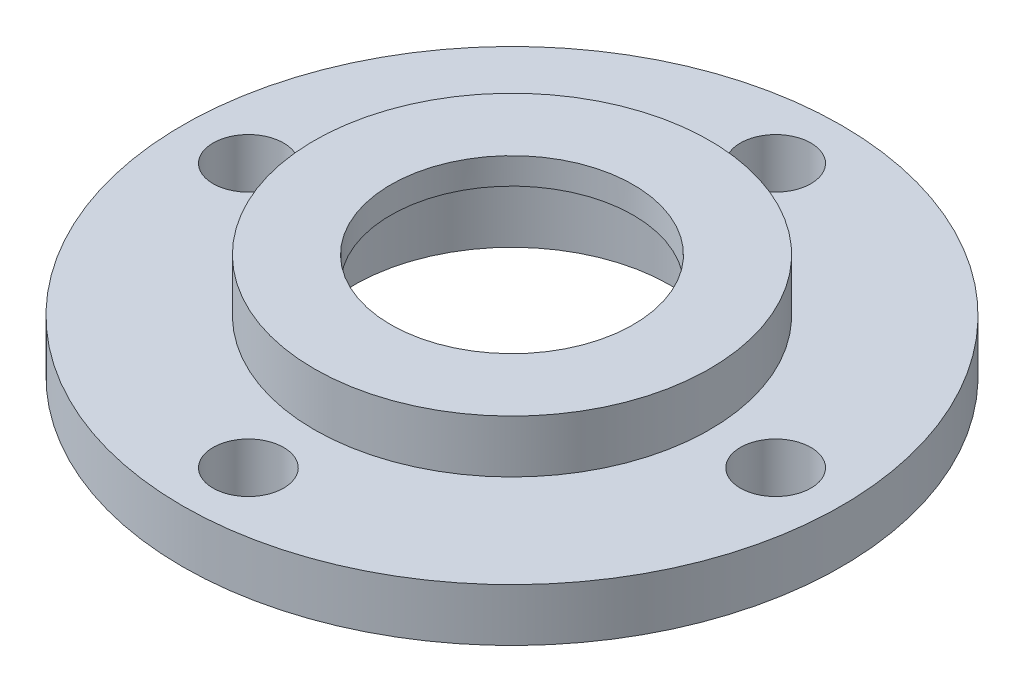
ISO-10303-21;
HEADER;
FILE_DESCRIPTION(('STEP AP214'),'2;1');
FILE_NAME('part.step','',(''),(''),'','','');
FILE_SCHEMA(('AUTOMOTIVE_DESIGN { 1 0 10303 214 1 1 1 1 }'));
ENDSEC;
DATA;
#1=APPLICATION_CONTEXT('core data for automotive mechanical design processes');
#2=APPLICATION_PROTOCOL_DEFINITION('international standard','automotive_design',2000,#1);
#3=PRODUCT_CONTEXT('',#1,'mechanical');
#4=PRODUCT('Part','Part','',(#3));
#5=PRODUCT_RELATED_PRODUCT_CATEGORY('part','',(#4));
#6=PRODUCT_DEFINITION_FORMATION('','',#4);
#7=PRODUCT_DEFINITION_CONTEXT('part definition',#1,'design');
#8=PRODUCT_DEFINITION('design','',#6,#7);
#9=PRODUCT_DEFINITION_SHAPE('','',#8);
#10=(LENGTH_UNIT() NAMED_UNIT(*) SI_UNIT(.MILLI.,.METRE.));
#11=(NAMED_UNIT(*) PLANE_ANGLE_UNIT() SI_UNIT($,.RADIAN.));
#12=(NAMED_UNIT(*) SI_UNIT($,.STERADIAN.) SOLID_ANGLE_UNIT());
#13=UNCERTAINTY_MEASURE_WITH_UNIT(LENGTH_MEASURE(1.E-05),#10,'distance_accuracy_value','');
#14=(GEOMETRIC_REPRESENTATION_CONTEXT(3) GLOBAL_UNCERTAINTY_ASSIGNED_CONTEXT((#13)) GLOBAL_UNIT_ASSIGNED_CONTEXT((#10,
#11,#12)) REPRESENTATION_CONTEXT('',''));
#15=CARTESIAN_POINT('',(0.,0.,0.));
#16=DIRECTION('',(0.,0.,1.));
#17=DIRECTION('',(1.,0.,0.));
#18=AXIS2_PLACEMENT_3D('',#15,#16,#17);
#19=CARTESIAN_POINT('',(0.,2.54,0.));
#20=DIRECTION('',(0.,-1.,0.));
#21=DIRECTION('',(0.,0.,-1.));
#22=AXIS2_PLACEMENT_3D('',#19,#20,#21);
#23=CYLINDRICAL_SURFACE('',#22,15.875);
#24=CARTESIAN_POINT('',(0.,2.54,0.));
#25=DIRECTION('',(0.,1.,0.));
#26=DIRECTION('',(0.,0.,1.));
#27=AXIS2_PLACEMENT_3D('',#24,#25,#26);
#28=CIRCLE('',#27,15.875);
#29=CARTESIAN_POINT('',(0.,2.54,15.875));
#30=VERTEX_POINT('',#29);
#31=EDGE_CURVE('E49',#30,#30,#28,.T.);
#32=ORIENTED_EDGE('',*,*,#31,.F.);
#33=EDGE_LOOP('',(#32));
#34=FACE_BOUND('',#33,.T.);
#35=CARTESIAN_POINT('',(0.,0.,0.));
#36=DIRECTION('',(0.,1.,0.));
#37=DIRECTION('',(0.,0.,1.));
#38=AXIS2_PLACEMENT_3D('',#35,#36,#37);
#39=CIRCLE('',#38,15.875);
#40=CARTESIAN_POINT('',(0.,0.,15.875));
#41=VERTEX_POINT('',#40);
#42=EDGE_CURVE('E44',#41,#41,#39,.T.);
#43=ORIENTED_EDGE('',*,*,#42,.T.);
#44=EDGE_LOOP('',(#43));
#45=FACE_BOUND('',#44,.T.);
#46=ADVANCED_FACE('F41',(#34,#45),#23,.T.);
#47=CARTESIAN_POINT('',(0.,2.54,0.));
#48=DIRECTION('',(0.,1.,0.));
#49=DIRECTION('',(0.,0.,1.));
#50=AXIS2_PLACEMENT_3D('',#47,#48,#49);
#51=PLANE('',#50);
#52=CARTESIAN_POINT('',(0.,2.54,-12.7));
#53=DIRECTION('',(0.,1.,0.));
#54=DIRECTION('',(0.,0.,1.));
#55=AXIS2_PLACEMENT_3D('',#52,#53,#54);
#56=CIRCLE('',#55,1.7);
#57=CARTESIAN_POINT('',(0.,2.54,-11.));
#58=VERTEX_POINT('',#57);
#59=EDGE_CURVE('E98',#58,#58,#56,.T.);
#60=ORIENTED_EDGE('',*,*,#59,.F.);
#61=EDGE_LOOP('',(#60));
#62=FACE_BOUND('',#61,.T.);
#63=CARTESIAN_POINT('',(12.7,2.54,0.));
#64=DIRECTION('',(0.,1.,0.));
#65=DIRECTION('',(0.,0.,1.));
#66=AXIS2_PLACEMENT_3D('',#63,#64,#65);
#67=CIRCLE('',#66,1.70000000000004);
#68=CARTESIAN_POINT('',(12.7,2.54,1.70000000000004));
#69=VERTEX_POINT('',#68);
#70=EDGE_CURVE('E94',#69,#69,#67,.T.);
#71=ORIENTED_EDGE('',*,*,#70,.F.);
#72=EDGE_LOOP('',(#71));
#73=FACE_BOUND('',#72,.T.);
#74=CARTESIAN_POINT('',(0.,2.54,12.7));
#75=DIRECTION('',(0.,1.,0.));
#76=DIRECTION('',(0.,0.,1.));
#77=AXIS2_PLACEMENT_3D('',#74,#75,#76);
#78=CIRCLE('',#77,1.7);
#79=CARTESIAN_POINT('',(0.,2.54,14.4));
#80=VERTEX_POINT('',#79);
#81=EDGE_CURVE('E86',#80,#80,#78,.T.);
#82=ORIENTED_EDGE('',*,*,#81,.F.);
#83=EDGE_LOOP('',(#82));
#84=FACE_BOUND('',#83,.T.);
#85=CARTESIAN_POINT('',(-12.7,2.54,0.));
#86=DIRECTION('',(0.,1.,0.));
#87=DIRECTION('',(0.,0.,1.));
#88=AXIS2_PLACEMENT_3D('',#85,#86,#87);
#89=CIRCLE('',#88,1.7);
#90=CARTESIAN_POINT('',(-12.7,2.54,1.7));
#91=VERTEX_POINT('',#90);
#92=EDGE_CURVE('E77',#91,#91,#89,.T.);
#93=ORIENTED_EDGE('',*,*,#92,.F.);
#94=EDGE_LOOP('',(#93));
#95=FACE_BOUND('',#94,.T.);
#96=CARTESIAN_POINT('',(0.,2.54,0.));
#97=DIRECTION('',(0.,1.,0.));
#98=DIRECTION('',(0.,0.,1.));
#99=AXIS2_PLACEMENT_3D('',#96,#97,#98);
#100=CIRCLE('',#99,9.525);
#101=CARTESIAN_POINT('',(0.,2.54,9.525));
#102=VERTEX_POINT('',#101);
#103=EDGE_CURVE('E10',#102,#102,#100,.T.);
#104=ORIENTED_EDGE('',*,*,#103,.F.);
#105=EDGE_LOOP('',(#104));
#106=FACE_BOUND('',#105,.T.);
#107=ORIENTED_EDGE('',*,*,#31,.T.);
#108=EDGE_LOOP('',(#107));
#109=FACE_BOUND('',#108,.T.);
#110=ADVANCED_FACE('F112',(#62,#73,#84,#95,#106,#109),#51,.T.);
#111=CARTESIAN_POINT('',(0.,0.,0.));
#112=DIRECTION('',(0.,1.,0.));
#113=DIRECTION('',(0.,0.,1.));
#114=AXIS2_PLACEMENT_3D('',#111,#112,#113);
#115=PLANE('',#114);
#116=CARTESIAN_POINT('',(0.,0.,-12.7));
#117=DIRECTION('',(0.,1.,0.));
#118=DIRECTION('',(0.,0.,1.));
#119=AXIS2_PLACEMENT_3D('',#116,#117,#118);
#120=CIRCLE('',#119,1.7);
#121=CARTESIAN_POINT('',(0.,0.,-11.));
#122=VERTEX_POINT('',#121);
#123=EDGE_CURVE('E73',#122,#122,#120,.F.);
#124=ORIENTED_EDGE('',*,*,#123,.F.);
#125=EDGE_LOOP('',(#124));
#126=FACE_BOUND('',#125,.T.);
#127=CARTESIAN_POINT('',(12.7,0.,0.));
#128=DIRECTION('',(0.,1.,0.));
#129=DIRECTION('',(0.,0.,1.));
#130=AXIS2_PLACEMENT_3D('',#127,#128,#129);
#131=CIRCLE('',#130,1.70000000000004);
#132=CARTESIAN_POINT('',(12.7,0.,1.70000000000004));
#133=VERTEX_POINT('',#132);
#134=EDGE_CURVE('E90',#133,#133,#131,.F.);
#135=ORIENTED_EDGE('',*,*,#134,.F.);
#136=EDGE_LOOP('',(#135));
#137=FACE_BOUND('',#136,.T.);
#138=CARTESIAN_POINT('',(0.,0.,12.7));
#139=DIRECTION('',(0.,1.,0.));
#140=DIRECTION('',(0.,0.,1.));
#141=AXIS2_PLACEMENT_3D('',#138,#139,#140);
#142=CIRCLE('',#141,1.7);
#143=CARTESIAN_POINT('',(0.,0.,14.4));
#144=VERTEX_POINT('',#143);
#145=EDGE_CURVE('E81',#144,#144,#142,.F.);
#146=ORIENTED_EDGE('',*,*,#145,.F.);
#147=EDGE_LOOP('',(#146));
#148=FACE_BOUND('',#147,.T.);
#149=CARTESIAN_POINT('',(-12.7,0.,0.));
#150=DIRECTION('',(0.,1.,0.));
#151=DIRECTION('',(0.,0.,1.));
#152=AXIS2_PLACEMENT_3D('',#149,#150,#151);
#153=CIRCLE('',#152,1.7);
#154=CARTESIAN_POINT('',(-12.7,0.,1.7));
#155=VERTEX_POINT('',#154);
#156=EDGE_CURVE('E82',#155,#155,#153,.F.);
#157=ORIENTED_EDGE('',*,*,#156,.F.);
#158=EDGE_LOOP('',(#157));
#159=FACE_BOUND('',#158,.T.);
#160=CARTESIAN_POINT('',(0.,0.,0.));
#161=DIRECTION('',(0.,-1.,0.));
#162=DIRECTION('',(0.,0.,-1.));
#163=AXIS2_PLACEMENT_3D('',#160,#161,#162);
#164=CIRCLE('',#163,7.62);
#165=CARTESIAN_POINT('',(0.,0.,-7.62));
#166=VERTEX_POINT('',#165);
#167=EDGE_CURVE('E61',#166,#166,#164,.T.);
#168=ORIENTED_EDGE('',*,*,#167,.F.);
#169=EDGE_LOOP('',(#168));
#170=FACE_BOUND('',#169,.T.);
#171=ORIENTED_EDGE('',*,*,#42,.F.);
#172=EDGE_LOOP('',(#171));
#173=FACE_BOUND('',#172,.T.);
#174=ADVANCED_FACE('F115',(#126,#137,#148,#159,#170,#173),#115,.F.);
#175=CARTESIAN_POINT('',(0.,5.08,0.));
#176=DIRECTION('',(0.,-1.,0.));
#177=DIRECTION('',(0.,0.,-1.));
#178=AXIS2_PLACEMENT_3D('',#175,#176,#177);
#179=CYLINDRICAL_SURFACE('',#178,9.525);
#180=CARTESIAN_POINT('',(0.,5.08,0.));
#181=DIRECTION('',(0.,1.,0.));
#182=DIRECTION('',(0.,0.,1.));
#183=AXIS2_PLACEMENT_3D('',#180,#181,#182);
#184=CIRCLE('',#183,9.525);
#185=CARTESIAN_POINT('',(0.,5.08,9.525));
#186=VERTEX_POINT('',#185);
#187=EDGE_CURVE('E56',#186,#186,#184,.T.);
#188=ORIENTED_EDGE('',*,*,#187,.F.);
#189=EDGE_LOOP('',(#188));
#190=FACE_BOUND('',#189,.T.);
#191=ORIENTED_EDGE('',*,*,#103,.T.);
#192=EDGE_LOOP('',(#191));
#193=FACE_BOUND('',#192,.T.);
#194=ADVANCED_FACE('F133',(#190,#193),#179,.T.);
#195=CARTESIAN_POINT('',(0.,5.08,0.));
#196=DIRECTION('',(0.,1.,0.));
#197=DIRECTION('',(0.,0.,1.));
#198=AXIS2_PLACEMENT_3D('',#195,#196,#197);
#199=PLANE('',#198);
#200=CARTESIAN_POINT('',(0.,5.08,0.));
#201=DIRECTION('',(0.,1.,0.));
#202=DIRECTION('',(0.,0.,1.));
#203=AXIS2_PLACEMENT_3D('',#200,#201,#202);
#204=CIRCLE('',#203,5.842);
#205=CARTESIAN_POINT('',(0.,5.08,5.842));
#206=VERTEX_POINT('',#205);
#207=EDGE_CURVE('E65',#206,#206,#204,.T.);
#208=ORIENTED_EDGE('',*,*,#207,.F.);
#209=EDGE_LOOP('',(#208));
#210=FACE_BOUND('',#209,.T.);
#211=ORIENTED_EDGE('',*,*,#187,.T.);
#212=EDGE_LOOP('',(#211));
#213=FACE_BOUND('',#212,.T.);
#214=ADVANCED_FACE('F138',(#210,#213),#199,.T.);
#215=CARTESIAN_POINT('',(0.,3.81,0.));
#216=DIRECTION('',(0.,-1.,0.));
#217=DIRECTION('',(0.,0.,-1.));
#218=AXIS2_PLACEMENT_3D('',#215,#216,#217);
#219=CYLINDRICAL_SURFACE('',#218,7.62);
#220=CARTESIAN_POINT('',(0.,3.81,0.));
#221=DIRECTION('',(0.,-1.,0.));
#222=DIRECTION('',(0.,0.,-1.));
#223=AXIS2_PLACEMENT_3D('',#220,#221,#222);
#224=CIRCLE('',#223,7.62);
#225=CARTESIAN_POINT('',(0.,3.81,-7.62));
#226=VERTEX_POINT('',#225);
#227=EDGE_CURVE('E60',#226,#226,#224,.T.);
#228=CARTESIAN_POINT('',(0.,3.81,-7.62));
#229=CARTESIAN_POINT('',(0.,3.7703125,-7.62));
#230=CARTESIAN_POINT('',(0.,3.730625,-7.62));
#231=CARTESIAN_POINT('',(0.,3.65125,-7.62));
#232=CARTESIAN_POINT('',(0.,3.6115625,-7.62));
#233=CARTESIAN_POINT('',(0.,3.5321875,-7.62));
#234=CARTESIAN_POINT('',(0.,3.4925,-7.62));
#235=CARTESIAN_POINT('',(0.,3.413125,-7.62));
#236=CARTESIAN_POINT('',(0.,3.3734375,-7.62));
#237=CARTESIAN_POINT('',(0.,3.2940625,-7.62));
#238=CARTESIAN_POINT('',(0.,3.254375,-7.62));
#239=CARTESIAN_POINT('',(0.,3.175,-7.62));
#240=CARTESIAN_POINT('',(0.,3.1353125,-7.62));
#241=CARTESIAN_POINT('',(0.,3.0559375,-7.62));
#242=CARTESIAN_POINT('',(0.,3.01625,-7.62));
#243=CARTESIAN_POINT('',(0.,2.936875,-7.62));
#244=CARTESIAN_POINT('',(0.,2.8971875,-7.62));
#245=CARTESIAN_POINT('',(0.,2.8178125,-7.62));
#246=CARTESIAN_POINT('',(0.,2.778125,-7.62));
#247=CARTESIAN_POINT('',(0.,2.69875,-7.62));
#248=CARTESIAN_POINT('',(0.,2.6590625,-7.62));
#249=CARTESIAN_POINT('',(0.,2.5796875,-7.62));
#250=CARTESIAN_POINT('',(0.,2.54,-7.62));
#251=CARTESIAN_POINT('',(0.,2.460625,-7.62));
#252=CARTESIAN_POINT('',(0.,2.4209375,-7.62));
#253=CARTESIAN_POINT('',(0.,2.3415625,-7.62));
#254=CARTESIAN_POINT('',(0.,2.301875,-7.62));
#255=CARTESIAN_POINT('',(0.,2.2225,-7.62));
#256=CARTESIAN_POINT('',(0.,2.1828125,-7.62));
#257=CARTESIAN_POINT('',(0.,2.1034375,-7.62));
#258=CARTESIAN_POINT('',(0.,2.06375,-7.62));
#259=CARTESIAN_POINT('',(0.,1.984375,-7.62));
#260=CARTESIAN_POINT('',(0.,1.9446875,-7.62));
#261=CARTESIAN_POINT('',(0.,1.8653125,-7.62));
#262=CARTESIAN_POINT('',(0.,1.825625,-7.62));
#263=CARTESIAN_POINT('',(0.,1.74625,-7.62));
#264=CARTESIAN_POINT('',(0.,1.7065625,-7.62));
#265=CARTESIAN_POINT('',(0.,1.6271875,-7.62));
#266=CARTESIAN_POINT('',(0.,1.5875,-7.62));
#267=CARTESIAN_POINT('',(0.,1.508125,-7.62));
#268=CARTESIAN_POINT('',(0.,1.4684375,-7.62));
#269=CARTESIAN_POINT('',(0.,1.3890625,-7.62));
#270=CARTESIAN_POINT('',(0.,1.349375,-7.62));
#271=CARTESIAN_POINT('',(0.,1.27,-7.62));
#272=CARTESIAN_POINT('',(0.,1.2303125,-7.62));
#273=CARTESIAN_POINT('',(0.,1.1509375,-7.62));
#274=CARTESIAN_POINT('',(0.,1.11125,-7.62));
#275=CARTESIAN_POINT('',(0.,1.031875,-7.62));
#276=CARTESIAN_POINT('',(0.,0.9921875,-7.62));
#277=CARTESIAN_POINT('',(0.,0.9128125,-7.62));
#278=CARTESIAN_POINT('',(0.,0.873125,-7.62));
#279=CARTESIAN_POINT('',(0.,0.79375,-7.62));
#280=CARTESIAN_POINT('',(0.,0.7540625,-7.62));
#281=CARTESIAN_POINT('',(0.,0.6746875,-7.62));
#282=CARTESIAN_POINT('',(0.,0.635,-7.62));
#283=CARTESIAN_POINT('',(0.,0.555625,-7.62));
#284=CARTESIAN_POINT('',(0.,0.5159375,-7.62));
#285=CARTESIAN_POINT('',(0.,0.4365625,-7.62));
#286=CARTESIAN_POINT('',(0.,0.396875,-7.62));
#287=CARTESIAN_POINT('',(0.,0.3175,-7.62));
#288=CARTESIAN_POINT('',(0.,0.2778125,-7.62));
#289=CARTESIAN_POINT('',(0.,0.1984375,-7.62));
#290=CARTESIAN_POINT('',(0.,0.15875,-7.62));
#291=CARTESIAN_POINT('',(0.,0.0793749999999999,-7.62));
#292=CARTESIAN_POINT('',(0.,0.0396874999999999,-7.62));
#293=CARTESIAN_POINT('',(0.,0.,-7.62));
#294=B_SPLINE_CURVE_WITH_KNOTS('',3,(#228,#229,#230,#231,#232,#233,#234,#235,#236,#237,#238,
#239,#240,#241,#242,#243,#244,#245,#246,#247,#248,#249,#250,#251,#252,#253,#254,#255,#256,#257,
#258,#259,#260,#261,#262,#263,#264,#265,#266,#267,#268,#269,#270,#271,#272,#273,#274,#275,#276,
#277,#278,#279,#280,#281,#282,#283,#284,#285,#286,#287,#288,#289,#290,#291,#292,#293),
.UNSPECIFIED.,.F.,.F.,(4,2,2,2,2,2,2,2,2,2,2,2,2,2,2,2,2,2,2,2,2,2,2,2,2,2,2,2,2,2,2,2,4),(0.,
0.1190625,0.238125,0.3571875,0.47625,0.5953125,0.714375,0.8334375,0.9525,1.0715625,1.190625,
1.3096875,1.42875,1.5478125,1.666875,1.7859375,1.905,2.0240625,2.143125,2.2621875,2.38125,
2.5003125,2.619375,2.7384375,2.8575,2.9765625,3.095625,3.2146875,3.33375,3.4528125,3.571875,
3.6909375,3.81),.UNSPECIFIED.);
#295=EDGE_CURVE('BSEAM146',#226,#166,#294,.T.);
#296=ORIENTED_EDGE('',*,*,#227,.F.);
#297=ORIENTED_EDGE('',*,*,#167,.T.);
#298=ORIENTED_EDGE('',*,*,#295,.T.);
#299=ORIENTED_EDGE('',*,*,#295,.F.);
#300=EDGE_LOOP('',(#296,#298,#297,#299));
#301=FACE_BOUND('',#300,.T.);
#302=ADVANCED_FACE('F146',(#301),#219,.F.);
#303=CARTESIAN_POINT('',(0.,3.81,0.));
#304=DIRECTION('',(0.,-1.,0.));
#305=DIRECTION('',(0.,0.,-1.));
#306=AXIS2_PLACEMENT_3D('',#303,#304,#305);
#307=PLANE('',#306);
#308=CARTESIAN_POINT('',(0.,3.81,0.));
#309=DIRECTION('',(0.,-1.,0.));
#310=DIRECTION('',(0.,0.,-1.));
#311=AXIS2_PLACEMENT_3D('',#308,#309,#310);
#312=CIRCLE('',#311,5.842);
#313=CARTESIAN_POINT('',(0.,3.81,-5.842));
#314=VERTEX_POINT('',#313);
#315=EDGE_CURVE('E69',#314,#314,#312,.F.);
#316=ORIENTED_EDGE('',*,*,#315,.T.);
#317=EDGE_LOOP('',(#316));
#318=FACE_BOUND('',#317,.T.);
#319=ORIENTED_EDGE('',*,*,#227,.T.);
#320=EDGE_LOOP('',(#319));
#321=FACE_BOUND('',#320,.T.);
#322=ADVANCED_FACE('F150',(#318,#321),#307,.T.);
#323=CARTESIAN_POINT('',(0.,-0.00100000000000013,0.));
#324=DIRECTION('',(0.,1.,0.));
#325=DIRECTION('',(0.,0.,1.));
#326=AXIS2_PLACEMENT_3D('',#323,#324,#325);
#327=CYLINDRICAL_SURFACE('',#326,5.842);
#328=ORIENTED_EDGE('',*,*,#315,.F.);
#329=EDGE_LOOP('',(#328));
#330=FACE_BOUND('',#329,.T.);
#331=ORIENTED_EDGE('',*,*,#207,.T.);
#332=EDGE_LOOP('',(#331));
#333=FACE_BOUND('',#332,.T.);
#334=ADVANCED_FACE('F154',(#330,#333),#327,.F.);
#335=CARTESIAN_POINT('',(-12.7,-0.00100000000000013,0.));
#336=DIRECTION('',(0.,1.,0.));
#337=DIRECTION('',(0.,0.,1.));
#338=AXIS2_PLACEMENT_3D('',#335,#336,#337);
#339=CYLINDRICAL_SURFACE('',#338,1.7);
#340=ORIENTED_EDGE('',*,*,#92,.T.);
#341=EDGE_LOOP('',(#340));
#342=FACE_BOUND('',#341,.T.);
#343=ORIENTED_EDGE('',*,*,#156,.T.);
#344=EDGE_LOOP('',(#343));
#345=FACE_BOUND('',#344,.T.);
#346=ADVANCED_FACE('F158',(#342,#345),#339,.F.);
#347=CARTESIAN_POINT('',(0.,-0.00100000000000013,12.7));
#348=DIRECTION('',(0.,1.,0.));
#349=DIRECTION('',(0.,0.,1.));
#350=AXIS2_PLACEMENT_3D('',#347,#348,#349);
#351=CYLINDRICAL_SURFACE('',#350,1.7);
#352=ORIENTED_EDGE('',*,*,#81,.T.);
#353=EDGE_LOOP('',(#352));
#354=FACE_BOUND('',#353,.T.);
#355=ORIENTED_EDGE('',*,*,#145,.T.);
#356=EDGE_LOOP('',(#355));
#357=FACE_BOUND('',#356,.T.);
#358=ADVANCED_FACE('F162',(#354,#357),#351,.F.);
#359=CARTESIAN_POINT('',(12.7,-0.00100000000000013,0.));
#360=DIRECTION('',(0.,1.,0.));
#361=DIRECTION('',(0.,0.,1.));
#362=AXIS2_PLACEMENT_3D('',#359,#360,#361);
#363=CYLINDRICAL_SURFACE('',#362,1.70000000000004);
#364=ORIENTED_EDGE('',*,*,#70,.T.);
#365=EDGE_LOOP('',(#364));
#366=FACE_BOUND('',#365,.T.);
#367=ORIENTED_EDGE('',*,*,#134,.T.);
#368=EDGE_LOOP('',(#367));
#369=FACE_BOUND('',#368,.T.);
#370=ADVANCED_FACE('F166',(#366,#369),#363,.F.);
#371=CARTESIAN_POINT('',(0.,-0.00100000000000013,-12.7));
#372=DIRECTION('',(0.,1.,0.));
#373=DIRECTION('',(0.,0.,1.));
#374=AXIS2_PLACEMENT_3D('',#371,#372,#373);
#375=CYLINDRICAL_SURFACE('',#374,1.7);
#376=ORIENTED_EDGE('',*,*,#59,.T.);
#377=EDGE_LOOP('',(#376));
#378=FACE_BOUND('',#377,.T.);
#379=ORIENTED_EDGE('',*,*,#123,.T.);
#380=EDGE_LOOP('',(#379));
#381=FACE_BOUND('',#380,.T.);
#382=ADVANCED_FACE('F109',(#378,#381),#375,.F.);
#383=CLOSED_SHELL('',(#46,#110,#174,#194,#214,#302,#322,#334,#346,#358,#370,#382));
#384=MANIFOLD_SOLID_BREP('B2',#383);
#385=ADVANCED_BREP_SHAPE_REPRESENTATION('',(#18,#384),#14);
#386=SHAPE_DEFINITION_REPRESENTATION(#9,#385);
ENDSEC;
END-ISO-10303-21;
